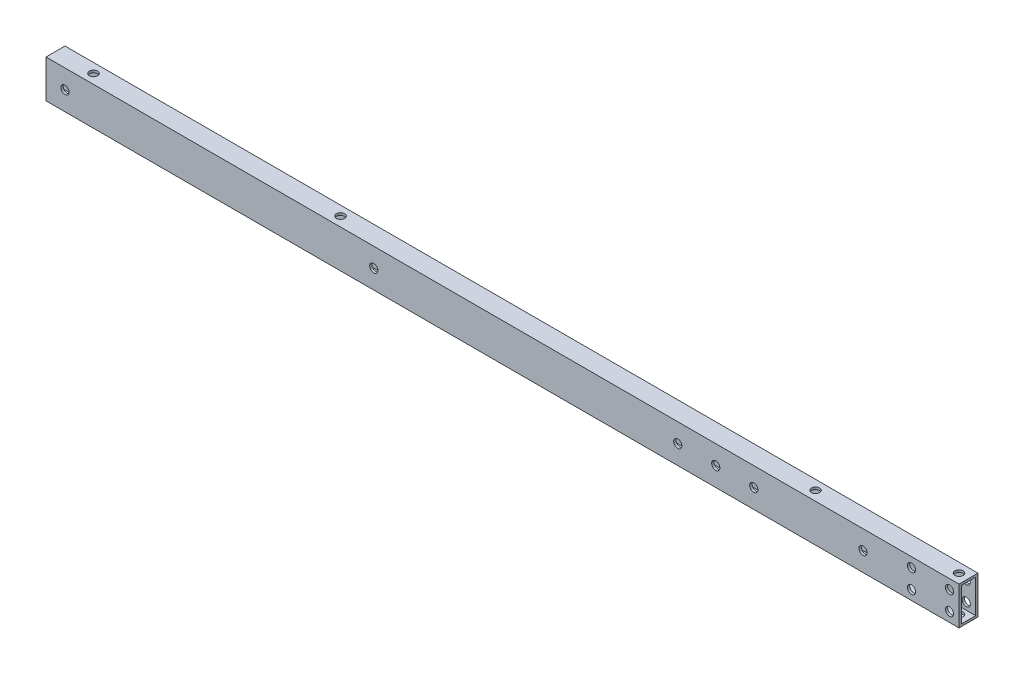
ISO-10303-21;
HEADER;
FILE_DESCRIPTION(('STEP AP214'),'2;1');
FILE_NAME('part.step','',(''),(''),'','','');
FILE_SCHEMA(('AUTOMOTIVE_DESIGN { 1 0 10303 214 1 1 1 1 }'));
ENDSEC;
DATA;
#1=APPLICATION_CONTEXT('core data for automotive mechanical design processes');
#2=APPLICATION_PROTOCOL_DEFINITION('international standard','automotive_design',2000,#1);
#3=PRODUCT_CONTEXT('',#1,'mechanical');
#4=PRODUCT('Part','Part','',(#3));
#5=PRODUCT_RELATED_PRODUCT_CATEGORY('part','',(#4));
#6=PRODUCT_DEFINITION_FORMATION('','',#4);
#7=PRODUCT_DEFINITION_CONTEXT('part definition',#1,'design');
#8=PRODUCT_DEFINITION('design','',#6,#7);
#9=PRODUCT_DEFINITION_SHAPE('','',#8);
#10=(LENGTH_UNIT() NAMED_UNIT(*) SI_UNIT(.MILLI.,.METRE.));
#11=(NAMED_UNIT(*) PLANE_ANGLE_UNIT() SI_UNIT($,.RADIAN.));
#12=(NAMED_UNIT(*) SI_UNIT($,.STERADIAN.) SOLID_ANGLE_UNIT());
#13=UNCERTAINTY_MEASURE_WITH_UNIT(LENGTH_MEASURE(1.E-05),#10,'distance_accuracy_value','');
#14=(GEOMETRIC_REPRESENTATION_CONTEXT(3) GLOBAL_UNCERTAINTY_ASSIGNED_CONTEXT((#13)) GLOBAL_UNIT_ASSIGNED_CONTEXT((#10,
#11,#12)) REPRESENTATION_CONTEXT('',''));
#15=CARTESIAN_POINT('',(0.,0.,0.));
#16=DIRECTION('',(0.,0.,1.));
#17=DIRECTION('',(1.,0.,0.));
#18=AXIS2_PLACEMENT_3D('',#15,#16,#17);
#19=CARTESIAN_POINT('',(480.5,0.,0.));
#20=DIRECTION('',(1.,0.,0.));
#21=DIRECTION('',(0.,0.,-1.));
#22=AXIS2_PLACEMENT_3D('',#19,#20,#21);
#23=PLANE('',#22);
#24=DIRECTION('',(0.,1.,0.));
#25=VECTOR('',#24,1.);
#26=CARTESIAN_POINT('',(480.5,10.,-5.));
#27=LINE('',#26,#25);
#28=CARTESIAN_POINT('',(480.5,-10.,-5.));
#29=VERTEX_POINT('',#28);
#30=CARTESIAN_POINT('',(480.5,10.,-5.));
#31=VERTEX_POINT('',#30);
#32=EDGE_CURVE('E164',#29,#31,#27,.T.);
#33=ORIENTED_EDGE('',*,*,#32,.T.);
#34=DIRECTION('',(0.,0.,1.));
#35=VECTOR('',#34,1.);
#36=CARTESIAN_POINT('',(480.5,10.,5.));
#37=LINE('',#36,#35);
#38=CARTESIAN_POINT('',(480.5,10.,5.));
#39=VERTEX_POINT('',#38);
#40=EDGE_CURVE('E167',#31,#39,#37,.T.);
#41=ORIENTED_EDGE('',*,*,#40,.T.);
#42=DIRECTION('',(0.,-1.,0.));
#43=VECTOR('',#42,1.);
#44=CARTESIAN_POINT('',(480.5,10.,5.));
#45=LINE('',#44,#43);
#46=CARTESIAN_POINT('',(480.5,-10.,5.));
#47=VERTEX_POINT('',#46);
#48=EDGE_CURVE('E170',#39,#47,#45,.T.);
#49=ORIENTED_EDGE('',*,*,#48,.T.);
#50=DIRECTION('',(0.,0.,-1.));
#51=VECTOR('',#50,1.);
#52=CARTESIAN_POINT('',(480.5,-10.,5.));
#53=LINE('',#52,#51);
#54=EDGE_CURVE('E172',#47,#29,#53,.T.);
#55=ORIENTED_EDGE('',*,*,#54,.T.);
#56=EDGE_LOOP('',(#33,#41,#49,#55));
#57=FACE_BOUND('',#56,.T.);
#58=DIRECTION('',(0.,0.,1.));
#59=VECTOR('',#58,1.);
#60=CARTESIAN_POINT('',(480.5,8.8,5.));
#61=LINE('',#60,#59);
#62=CARTESIAN_POINT('',(480.5,8.8,-3.8));
#63=VERTEX_POINT('',#62);
#64=CARTESIAN_POINT('',(480.5,8.8,3.8));
#65=VERTEX_POINT('',#64);
#66=EDGE_CURVE('E134',#63,#65,#61,.T.);
#67=ORIENTED_EDGE('',*,*,#66,.F.);
#68=DIRECTION('',(0.,1.,0.));
#69=VECTOR('',#68,1.);
#70=CARTESIAN_POINT('',(480.5,10.,-3.8));
#71=LINE('',#70,#69);
#72=CARTESIAN_POINT('',(480.5,-8.8,-3.8));
#73=VERTEX_POINT('',#72);
#74=EDGE_CURVE('E126',#73,#63,#71,.T.);
#75=ORIENTED_EDGE('',*,*,#74,.F.);
#76=DIRECTION('',(0.,0.,-1.));
#77=VECTOR('',#76,1.);
#78=CARTESIAN_POINT('',(480.5,-8.8,5.));
#79=LINE('',#78,#77);
#80=CARTESIAN_POINT('',(480.5,-8.8,3.8));
#81=VERTEX_POINT('',#80);
#82=EDGE_CURVE('E148',#81,#73,#79,.T.);
#83=ORIENTED_EDGE('',*,*,#82,.F.);
#84=DIRECTION('',(0.,-1.,0.));
#85=VECTOR('',#84,1.);
#86=CARTESIAN_POINT('',(480.5,10.,3.8));
#87=LINE('',#86,#85);
#88=EDGE_CURVE('E146',#65,#81,#87,.T.);
#89=ORIENTED_EDGE('',*,*,#88,.F.);
#90=EDGE_LOOP('',(#67,#75,#83,#89));
#91=FACE_BOUND('',#90,.T.);
#92=ADVANCED_FACE('F59',(#57,#91),#23,.T.);
#93=CARTESIAN_POINT('',(0.,0.,0.));
#94=DIRECTION('',(1.,0.,0.));
#95=DIRECTION('',(0.,0.,-1.));
#96=AXIS2_PLACEMENT_3D('',#93,#94,#95);
#97=PLANE('',#96);
#98=DIRECTION('',(0.,1.,0.));
#99=VECTOR('',#98,1.);
#100=CARTESIAN_POINT('',(0.,10.,-5.));
#101=LINE('',#100,#99);
#102=CARTESIAN_POINT('',(0.,-10.,-5.));
#103=VERTEX_POINT('',#102);
#104=CARTESIAN_POINT('',(0.,10.,-5.));
#105=VERTEX_POINT('',#104);
#106=EDGE_CURVE('E142',#103,#105,#101,.T.);
#107=ORIENTED_EDGE('',*,*,#106,.F.);
#108=DIRECTION('',(0.,0.,-1.));
#109=VECTOR('',#108,1.);
#110=CARTESIAN_POINT('',(0.,-10.,5.));
#111=LINE('',#110,#109);
#112=CARTESIAN_POINT('',(0.,-10.,5.));
#113=VERTEX_POINT('',#112);
#114=EDGE_CURVE('E168',#113,#103,#111,.T.);
#115=ORIENTED_EDGE('',*,*,#114,.F.);
#116=DIRECTION('',(0.,-1.,0.));
#117=VECTOR('',#116,1.);
#118=CARTESIAN_POINT('',(0.,10.,5.));
#119=LINE('',#118,#117);
#120=CARTESIAN_POINT('',(0.,10.,5.));
#121=VERTEX_POINT('',#120);
#122=EDGE_CURVE('E179',#121,#113,#119,.T.);
#123=ORIENTED_EDGE('',*,*,#122,.F.);
#124=DIRECTION('',(0.,0.,1.));
#125=VECTOR('',#124,1.);
#126=CARTESIAN_POINT('',(0.,10.,5.));
#127=LINE('',#126,#125);
#128=EDGE_CURVE('E177',#105,#121,#127,.T.);
#129=ORIENTED_EDGE('',*,*,#128,.F.);
#130=EDGE_LOOP('',(#107,#115,#123,#129));
#131=FACE_BOUND('',#130,.T.);
#132=DIRECTION('',(0.,1.,0.));
#133=VECTOR('',#132,1.);
#134=CARTESIAN_POINT('',(0.,10.,-3.8));
#135=LINE('',#134,#133);
#136=CARTESIAN_POINT('',(0.,-8.8,-3.8));
#137=VERTEX_POINT('',#136);
#138=CARTESIAN_POINT('',(0.,8.8,-3.8));
#139=VERTEX_POINT('',#138);
#140=EDGE_CURVE('E84',#137,#139,#135,.T.);
#141=ORIENTED_EDGE('',*,*,#140,.T.);
#142=DIRECTION('',(0.,0.,1.));
#143=VECTOR('',#142,1.);
#144=CARTESIAN_POINT('',(0.,8.8,5.));
#145=LINE('',#144,#143);
#146=CARTESIAN_POINT('',(0.,8.8,3.8));
#147=VERTEX_POINT('',#146);
#148=EDGE_CURVE('E141',#139,#147,#145,.T.);
#149=ORIENTED_EDGE('',*,*,#148,.T.);
#150=DIRECTION('',(0.,-1.,0.));
#151=VECTOR('',#150,1.);
#152=CARTESIAN_POINT('',(0.,10.,3.8));
#153=LINE('',#152,#151);
#154=CARTESIAN_POINT('',(0.,-8.8,3.8));
#155=VERTEX_POINT('',#154);
#156=EDGE_CURVE('E156',#147,#155,#153,.T.);
#157=ORIENTED_EDGE('',*,*,#156,.T.);
#158=DIRECTION('',(0.,0.,-1.));
#159=VECTOR('',#158,1.);
#160=CARTESIAN_POINT('',(0.,-8.8,5.));
#161=LINE('',#160,#159);
#162=EDGE_CURVE('E135',#155,#137,#161,.T.);
#163=ORIENTED_EDGE('',*,*,#162,.T.);
#164=EDGE_LOOP('',(#141,#149,#157,#163));
#165=FACE_BOUND('',#164,.T.);
#166=ADVANCED_FACE('F370',(#131,#165),#97,.F.);
#167=CARTESIAN_POINT('',(480.5,10.,-5.));
#168=DIRECTION('',(0.,0.,1.));
#169=DIRECTION('',(0.,-1.,0.));
#170=AXIS2_PLACEMENT_3D('',#167,#168,#169);
#171=PLANE('',#170);
#172=CARTESIAN_POINT('',(475.5,5.,-5.));
#173=DIRECTION('',(0.,0.,1.));
#174=DIRECTION('',(1.,0.,0.));
#175=AXIS2_PLACEMENT_3D('',#172,#173,#174);
#176=CIRCLE('',#175,2.14999999999996);
#177=CARTESIAN_POINT('',(477.65,5.,-5.));
#178=VERTEX_POINT('',#177);
#179=EDGE_CURVE('E273',#178,#178,#176,.T.);
#180=ORIENTED_EDGE('',*,*,#179,.T.);
#181=EDGE_LOOP('',(#180));
#182=FACE_BOUND('',#181,.T.);
#183=CARTESIAN_POINT('',(172.5,0.,-5.));
#184=DIRECTION('',(0.,0.,1.));
#185=DIRECTION('',(1.,0.,0.));
#186=AXIS2_PLACEMENT_3D('',#183,#184,#185);
#187=CIRCLE('',#186,2.15000000000002);
#188=CARTESIAN_POINT('',(174.65,0.,-5.));
#189=VERTEX_POINT('',#188);
#190=EDGE_CURVE('E280',#189,#189,#187,.T.);
#191=ORIENTED_EDGE('',*,*,#190,.T.);
#192=EDGE_LOOP('',(#191));
#193=FACE_BOUND('',#192,.T.);
#194=CARTESIAN_POINT('',(475.5,-4.99999999999997,-5.));
#195=DIRECTION('',(0.,0.,1.));
#196=DIRECTION('',(-1.,0.,0.));
#197=AXIS2_PLACEMENT_3D('',#194,#195,#196);
#198=CIRCLE('',#197,2.14999999999996);
#199=CARTESIAN_POINT('',(473.35,-4.99999999999997,-5.));
#200=VERTEX_POINT('',#199);
#201=EDGE_CURVE('E261',#200,#200,#198,.T.);
#202=ORIENTED_EDGE('',*,*,#201,.T.);
#203=EDGE_LOOP('',(#202));
#204=FACE_BOUND('',#203,.T.);
#205=CARTESIAN_POINT('',(455.5,5.,-5.));
#206=DIRECTION('',(0.,0.,1.));
#207=DIRECTION('',(1.,0.,0.));
#208=AXIS2_PLACEMENT_3D('',#205,#206,#207);
#209=CIRCLE('',#208,2.14999999999996);
#210=CARTESIAN_POINT('',(457.65,5.,-5.));
#211=VERTEX_POINT('',#210);
#212=EDGE_CURVE('E268',#211,#211,#209,.T.);
#213=ORIENTED_EDGE('',*,*,#212,.T.);
#214=EDGE_LOOP('',(#213));
#215=FACE_BOUND('',#214,.T.);
#216=CARTESIAN_POINT('',(332.5,0.,-5.));
#217=DIRECTION('',(0.,0.,1.));
#218=DIRECTION('',(-1.,0.,0.));
#219=AXIS2_PLACEMENT_3D('',#216,#217,#218);
#220=CIRCLE('',#219,2.15000000000002);
#221=CARTESIAN_POINT('',(330.35,0.,-5.));
#222=VERTEX_POINT('',#221);
#223=EDGE_CURVE('E297',#222,#222,#220,.T.);
#224=ORIENTED_EDGE('',*,*,#223,.T.);
#225=EDGE_LOOP('',(#224));
#226=FACE_BOUND('',#225,.T.);
#227=CARTESIAN_POINT('',(352.5,0.,-5.));
#228=DIRECTION('',(0.,0.,1.));
#229=DIRECTION('',(1.,0.,0.));
#230=AXIS2_PLACEMENT_3D('',#227,#228,#229);
#231=CIRCLE('',#230,2.15000000000002);
#232=CARTESIAN_POINT('',(354.65,0.,-5.));
#233=VERTEX_POINT('',#232);
#234=EDGE_CURVE('E304',#233,#233,#231,.T.);
#235=ORIENTED_EDGE('',*,*,#234,.T.);
#236=EDGE_LOOP('',(#235));
#237=FACE_BOUND('',#236,.T.);
#238=CARTESIAN_POINT('',(430.,0.,-5.));
#239=DIRECTION('',(0.,0.,1.));
#240=DIRECTION('',(1.,0.,0.));
#241=AXIS2_PLACEMENT_3D('',#238,#239,#240);
#242=CIRCLE('',#241,2.14999999999996);
#243=CARTESIAN_POINT('',(432.15,0.,-5.));
#244=VERTEX_POINT('',#243);
#245=EDGE_CURVE('E285',#244,#244,#242,.T.);
#246=ORIENTED_EDGE('',*,*,#245,.T.);
#247=EDGE_LOOP('',(#246));
#248=FACE_BOUND('',#247,.T.);
#249=CARTESIAN_POINT('',(10.,0.,-5.));
#250=DIRECTION('',(0.,0.,1.));
#251=DIRECTION('',(1.,0.,0.));
#252=AXIS2_PLACEMENT_3D('',#249,#250,#251);
#253=CIRCLE('',#252,2.15);
#254=CARTESIAN_POINT('',(12.15,0.,-5.));
#255=VERTEX_POINT('',#254);
#256=EDGE_CURVE('E292',#255,#255,#253,.T.);
#257=ORIENTED_EDGE('',*,*,#256,.T.);
#258=EDGE_LOOP('',(#257));
#259=FACE_BOUND('',#258,.T.);
#260=CARTESIAN_POINT('',(455.5,-4.99999999999998,-5.));
#261=DIRECTION('',(0.,0.,1.));
#262=DIRECTION('',(1.,0.,0.));
#263=AXIS2_PLACEMENT_3D('',#260,#261,#262);
#264=CIRCLE('',#263,2.14999999999996);
#265=CARTESIAN_POINT('',(457.65,-4.99999999999998,-5.));
#266=VERTEX_POINT('',#265);
#267=EDGE_CURVE('E255',#266,#266,#264,.T.);
#268=ORIENTED_EDGE('',*,*,#267,.T.);
#269=EDGE_LOOP('',(#268));
#270=FACE_BOUND('',#269,.T.);
#271=CARTESIAN_POINT('',(372.5,0.,-5.));
#272=DIRECTION('',(0.,0.,1.));
#273=DIRECTION('',(1.,0.,0.));
#274=AXIS2_PLACEMENT_3D('',#271,#272,#273);
#275=CIRCLE('',#274,2.15000000000002);
#276=CARTESIAN_POINT('',(374.65,0.,-5.));
#277=VERTEX_POINT('',#276);
#278=EDGE_CURVE('E193',#277,#277,#275,.T.);
#279=ORIENTED_EDGE('',*,*,#278,.T.);
#280=EDGE_LOOP('',(#279));
#281=FACE_BOUND('',#280,.T.);
#282=ORIENTED_EDGE('',*,*,#106,.T.);
#283=DIRECTION('',(-1.,0.,0.));
#284=VECTOR('',#283,1.);
#285=CARTESIAN_POINT('',(480.5,10.,-5.));
#286=LINE('',#285,#284);
#287=EDGE_CURVE('E12',#31,#105,#286,.T.);
#288=ORIENTED_EDGE('',*,*,#287,.F.);
#289=ORIENTED_EDGE('',*,*,#32,.F.);
#290=DIRECTION('',(-1.,0.,0.));
#291=VECTOR('',#290,1.);
#292=CARTESIAN_POINT('',(480.5,-10.,-5.));
#293=LINE('',#292,#291);
#294=EDGE_CURVE('E174',#29,#103,#293,.T.);
#295=ORIENTED_EDGE('',*,*,#294,.T.);
#296=EDGE_LOOP('',(#282,#288,#289,#295));
#297=FACE_BOUND('',#296,.T.);
#298=ADVANCED_FACE('F61',(#182,#193,#204,#215,#226,#237,#248,#259,#270,#281,#297),#171,.F.);
#299=CARTESIAN_POINT('',(480.5,10.,5.));
#300=DIRECTION('',(0.,-1.,0.));
#301=DIRECTION('',(0.,0.,-1.));
#302=AXIS2_PLACEMENT_3D('',#299,#300,#301);
#303=PLANE('',#302);
#304=CARTESIAN_POINT('',(475.5,10.,0.));
#305=DIRECTION('',(0.,1.,0.));
#306=DIRECTION('',(0.,0.,1.));
#307=AXIS2_PLACEMENT_3D('',#304,#305,#306);
#308=CIRCLE('',#307,2.14999999999996);
#309=CARTESIAN_POINT('',(475.5,10.,2.14999999999996));
#310=VERTEX_POINT('',#309);
#311=EDGE_CURVE('E497',#310,#310,#308,.T.);
#312=ORIENTED_EDGE('',*,*,#311,.F.);
#313=EDGE_LOOP('',(#312));
#314=FACE_BOUND('',#313,.T.);
#315=CARTESIAN_POINT('',(400.,10.,0.));
#316=DIRECTION('',(0.,1.,0.));
#317=DIRECTION('',(0.,0.,1.));
#318=AXIS2_PLACEMENT_3D('',#315,#316,#317);
#319=CIRCLE('',#318,2.14999999999996);
#320=CARTESIAN_POINT('',(400.,10.,2.14999999999997));
#321=VERTEX_POINT('',#320);
#322=EDGE_CURVE('E503',#321,#321,#319,.T.);
#323=ORIENTED_EDGE('',*,*,#322,.F.);
#324=EDGE_LOOP('',(#323));
#325=FACE_BOUND('',#324,.T.);
#326=CARTESIAN_POINT('',(150.,10.,0.));
#327=DIRECTION('',(0.,1.,0.));
#328=DIRECTION('',(0.,0.,1.));
#329=AXIS2_PLACEMENT_3D('',#326,#327,#328);
#330=CIRCLE('',#329,2.15000000000002);
#331=CARTESIAN_POINT('',(150.,10.,2.15000000000002));
#332=VERTEX_POINT('',#331);
#333=EDGE_CURVE('E511',#332,#332,#330,.T.);
#334=ORIENTED_EDGE('',*,*,#333,.F.);
#335=EDGE_LOOP('',(#334));
#336=FACE_BOUND('',#335,.T.);
#337=CARTESIAN_POINT('',(20.,10.,0.));
#338=DIRECTION('',(0.,1.,0.));
#339=DIRECTION('',(0.,0.,1.));
#340=AXIS2_PLACEMENT_3D('',#337,#338,#339);
#341=CIRCLE('',#340,2.15);
#342=CARTESIAN_POINT('',(20.,10.,2.15));
#343=VERTEX_POINT('',#342);
#344=EDGE_CURVE('E516',#343,#343,#341,.T.);
#345=ORIENTED_EDGE('',*,*,#344,.F.);
#346=EDGE_LOOP('',(#345));
#347=FACE_BOUND('',#346,.T.);
#348=ORIENTED_EDGE('',*,*,#128,.T.);
#349=DIRECTION('',(-1.,0.,0.));
#350=VECTOR('',#349,1.);
#351=CARTESIAN_POINT('',(480.5,10.,5.));
#352=LINE('',#351,#350);
#353=EDGE_CURVE('E68',#39,#121,#352,.T.);
#354=ORIENTED_EDGE('',*,*,#353,.F.);
#355=ORIENTED_EDGE('',*,*,#40,.F.);
#356=ORIENTED_EDGE('',*,*,#287,.T.);
#357=EDGE_LOOP('',(#348,#354,#355,#356));
#358=FACE_BOUND('',#357,.T.);
#359=ADVANCED_FACE('F369',(#314,#325,#336,#347,#358),#303,.F.);
#360=CARTESIAN_POINT('',(480.5,10.,5.));
#361=DIRECTION('',(0.,0.,-1.));
#362=DIRECTION('',(0.,1.,0.));
#363=AXIS2_PLACEMENT_3D('',#360,#361,#362);
#364=PLANE('',#363);
#365=CARTESIAN_POINT('',(475.5,5.,5.));
#366=DIRECTION('',(0.,0.,1.));
#367=DIRECTION('',(1.,0.,0.));
#368=AXIS2_PLACEMENT_3D('',#365,#366,#367);
#369=CIRCLE('',#368,2.14999999999996);
#370=CARTESIAN_POINT('',(477.65,5.,5.));
#371=VERTEX_POINT('',#370);
#372=EDGE_CURVE('E277',#371,#371,#369,.T.);
#373=ORIENTED_EDGE('',*,*,#372,.F.);
#374=EDGE_LOOP('',(#373));
#375=FACE_BOUND('',#374,.T.);
#376=CARTESIAN_POINT('',(172.5,0.,5.));
#377=DIRECTION('',(0.,0.,1.));
#378=DIRECTION('',(1.,0.,0.));
#379=AXIS2_PLACEMENT_3D('',#376,#377,#378);
#380=CIRCLE('',#379,2.15000000000002);
#381=CARTESIAN_POINT('',(174.65,0.,5.));
#382=VERTEX_POINT('',#381);
#383=EDGE_CURVE('E264',#382,#382,#380,.T.);
#384=ORIENTED_EDGE('',*,*,#383,.F.);
#385=EDGE_LOOP('',(#384));
#386=FACE_BOUND('',#385,.T.);
#387=CARTESIAN_POINT('',(475.5,-4.99999999999997,5.));
#388=DIRECTION('',(0.,0.,1.));
#389=DIRECTION('',(-1.,0.,0.));
#390=AXIS2_PLACEMENT_3D('',#387,#388,#389);
#391=CIRCLE('',#390,2.14999999999996);
#392=CARTESIAN_POINT('',(473.35,-4.99999999999997,5.));
#393=VERTEX_POINT('',#392);
#394=EDGE_CURVE('E265',#393,#393,#391,.T.);
#395=ORIENTED_EDGE('',*,*,#394,.F.);
#396=EDGE_LOOP('',(#395));
#397=FACE_BOUND('',#396,.T.);
#398=CARTESIAN_POINT('',(455.5,5.,5.));
#399=DIRECTION('',(0.,0.,1.));
#400=DIRECTION('',(1.,0.,0.));
#401=AXIS2_PLACEMENT_3D('',#398,#399,#400);
#402=CIRCLE('',#401,2.14999999999996);
#403=CARTESIAN_POINT('',(457.65,5.,5.));
#404=VERTEX_POINT('',#403);
#405=EDGE_CURVE('E258',#404,#404,#402,.T.);
#406=ORIENTED_EDGE('',*,*,#405,.F.);
#407=EDGE_LOOP('',(#406));
#408=FACE_BOUND('',#407,.T.);
#409=CARTESIAN_POINT('',(332.5,0.,5.));
#410=DIRECTION('',(0.,0.,1.));
#411=DIRECTION('',(-1.,0.,0.));
#412=AXIS2_PLACEMENT_3D('',#409,#410,#411);
#413=CIRCLE('',#412,2.15000000000002);
#414=CARTESIAN_POINT('',(330.35,0.,5.));
#415=VERTEX_POINT('',#414);
#416=EDGE_CURVE('E301',#415,#415,#413,.T.);
#417=ORIENTED_EDGE('',*,*,#416,.F.);
#418=EDGE_LOOP('',(#417));
#419=FACE_BOUND('',#418,.T.);
#420=CARTESIAN_POINT('',(352.5,0.,5.));
#421=DIRECTION('',(0.,0.,1.));
#422=DIRECTION('',(1.,0.,0.));
#423=AXIS2_PLACEMENT_3D('',#420,#421,#422);
#424=CIRCLE('',#423,2.15000000000002);
#425=CARTESIAN_POINT('',(354.65,0.,5.));
#426=VERTEX_POINT('',#425);
#427=EDGE_CURVE('E288',#426,#426,#424,.T.);
#428=ORIENTED_EDGE('',*,*,#427,.F.);
#429=EDGE_LOOP('',(#428));
#430=FACE_BOUND('',#429,.T.);
#431=CARTESIAN_POINT('',(430.,0.,5.));
#432=DIRECTION('',(0.,0.,1.));
#433=DIRECTION('',(1.,0.,0.));
#434=AXIS2_PLACEMENT_3D('',#431,#432,#433);
#435=CIRCLE('',#434,2.14999999999996);
#436=CARTESIAN_POINT('',(432.15,0.,5.));
#437=VERTEX_POINT('',#436);
#438=EDGE_CURVE('E289',#437,#437,#435,.T.);
#439=ORIENTED_EDGE('',*,*,#438,.F.);
#440=EDGE_LOOP('',(#439));
#441=FACE_BOUND('',#440,.T.);
#442=CARTESIAN_POINT('',(10.,0.,5.));
#443=DIRECTION('',(0.,0.,1.));
#444=DIRECTION('',(1.,0.,0.));
#445=AXIS2_PLACEMENT_3D('',#442,#443,#444);
#446=CIRCLE('',#445,2.15);
#447=CARTESIAN_POINT('',(12.15,0.,5.));
#448=VERTEX_POINT('',#447);
#449=EDGE_CURVE('E276',#448,#448,#446,.T.);
#450=ORIENTED_EDGE('',*,*,#449,.F.);
#451=EDGE_LOOP('',(#450));
#452=FACE_BOUND('',#451,.T.);
#453=CARTESIAN_POINT('',(455.5,-4.99999999999998,5.));
#454=DIRECTION('',(0.,0.,1.));
#455=DIRECTION('',(1.,0.,0.));
#456=AXIS2_PLACEMENT_3D('',#453,#454,#455);
#457=CIRCLE('',#456,2.14999999999996);
#458=CARTESIAN_POINT('',(457.65,-4.99999999999998,5.));
#459=VERTEX_POINT('',#458);
#460=EDGE_CURVE('E254',#459,#459,#457,.T.);
#461=ORIENTED_EDGE('',*,*,#460,.F.);
#462=EDGE_LOOP('',(#461));
#463=FACE_BOUND('',#462,.T.);
#464=CARTESIAN_POINT('',(372.5,0.,5.));
#465=DIRECTION('',(0.,0.,1.));
#466=DIRECTION('',(1.,0.,0.));
#467=AXIS2_PLACEMENT_3D('',#464,#465,#466);
#468=CIRCLE('',#467,2.15000000000002);
#469=CARTESIAN_POINT('',(374.65,0.,5.));
#470=VERTEX_POINT('',#469);
#471=EDGE_CURVE('E300',#470,#470,#468,.T.);
#472=ORIENTED_EDGE('',*,*,#471,.F.);
#473=EDGE_LOOP('',(#472));
#474=FACE_BOUND('',#473,.T.);
#475=ORIENTED_EDGE('',*,*,#122,.T.);
#476=DIRECTION('',(-1.,0.,0.));
#477=VECTOR('',#476,1.);
#478=CARTESIAN_POINT('',(480.5,-10.,5.));
#479=LINE('',#478,#477);
#480=EDGE_CURVE('E184',#47,#113,#479,.T.);
#481=ORIENTED_EDGE('',*,*,#480,.F.);
#482=ORIENTED_EDGE('',*,*,#48,.F.);
#483=ORIENTED_EDGE('',*,*,#353,.T.);
#484=EDGE_LOOP('',(#475,#481,#482,#483));
#485=FACE_BOUND('',#484,.T.);
#486=ADVANCED_FACE('F388',(#375,#386,#397,#408,#419,#430,#441,#452,#463,#474,#485),#364,.F.);
#487=CARTESIAN_POINT('',(480.5,-10.,5.));
#488=DIRECTION('',(0.,1.,0.));
#489=DIRECTION('',(0.,0.,1.));
#490=AXIS2_PLACEMENT_3D('',#487,#488,#489);
#491=PLANE('',#490);
#492=CARTESIAN_POINT('',(475.5,-10.,0.));
#493=DIRECTION('',(0.,1.,0.));
#494=DIRECTION('',(0.,0.,1.));
#495=AXIS2_PLACEMENT_3D('',#492,#493,#494);
#496=CIRCLE('',#495,2.14999999999996);
#497=CARTESIAN_POINT('',(475.5,-10.,2.14999999999996));
#498=VERTEX_POINT('',#497);
#499=EDGE_CURVE('E233',#498,#498,#496,.T.);
#500=ORIENTED_EDGE('',*,*,#499,.T.);
#501=EDGE_LOOP('',(#500));
#502=FACE_BOUND('',#501,.T.);
#503=CARTESIAN_POINT('',(400.,-10.,0.));
#504=DIRECTION('',(0.,1.,0.));
#505=DIRECTION('',(0.,0.,1.));
#506=AXIS2_PLACEMENT_3D('',#503,#504,#505);
#507=CIRCLE('',#506,2.14999999999996);
#508=CARTESIAN_POINT('',(400.,-10.,2.14999999999997));
#509=VERTEX_POINT('',#508);
#510=EDGE_CURVE('E498',#509,#509,#507,.T.);
#511=ORIENTED_EDGE('',*,*,#510,.T.);
#512=EDGE_LOOP('',(#511));
#513=FACE_BOUND('',#512,.T.);
#514=CARTESIAN_POINT('',(150.,-10.,0.));
#515=DIRECTION('',(0.,1.,0.));
#516=DIRECTION('',(0.,0.,1.));
#517=AXIS2_PLACEMENT_3D('',#514,#515,#516);
#518=CIRCLE('',#517,2.15000000000002);
#519=CARTESIAN_POINT('',(150.,-10.,2.15000000000002));
#520=VERTEX_POINT('',#519);
#521=EDGE_CURVE('E508',#520,#520,#518,.T.);
#522=ORIENTED_EDGE('',*,*,#521,.T.);
#523=EDGE_LOOP('',(#522));
#524=FACE_BOUND('',#523,.T.);
#525=CARTESIAN_POINT('',(20.,-10.,0.));
#526=DIRECTION('',(0.,1.,0.));
#527=DIRECTION('',(0.,0.,1.));
#528=AXIS2_PLACEMENT_3D('',#525,#526,#527);
#529=CIRCLE('',#528,2.15);
#530=CARTESIAN_POINT('',(20.,-10.,2.15));
#531=VERTEX_POINT('',#530);
#532=EDGE_CURVE('E514',#531,#531,#529,.T.);
#533=ORIENTED_EDGE('',*,*,#532,.T.);
#534=EDGE_LOOP('',(#533));
#535=FACE_BOUND('',#534,.T.);
#536=ORIENTED_EDGE('',*,*,#114,.T.);
#537=ORIENTED_EDGE('',*,*,#294,.F.);
#538=ORIENTED_EDGE('',*,*,#54,.F.);
#539=ORIENTED_EDGE('',*,*,#480,.T.);
#540=EDGE_LOOP('',(#536,#537,#538,#539));
#541=FACE_BOUND('',#540,.T.);
#542=ADVANCED_FACE('F338',(#502,#513,#524,#535,#541),#491,.F.);
#543=CARTESIAN_POINT('',(480.5,10.,-3.8));
#544=DIRECTION('',(0.,0.,1.));
#545=DIRECTION('',(0.,-1.,0.));
#546=AXIS2_PLACEMENT_3D('',#543,#544,#545);
#547=PLANE('',#546);
#548=CARTESIAN_POINT('',(475.5,5.,-3.8));
#549=DIRECTION('',(0.,0.,1.));
#550=DIRECTION('',(0.,-1.,0.));
#551=AXIS2_PLACEMENT_3D('',#548,#549,#550);
#552=CIRCLE('',#551,2.14999999999996);
#553=CARTESIAN_POINT('',(475.5,2.85000000000004,-3.8));
#554=VERTEX_POINT('',#553);
#555=EDGE_CURVE('E154',#554,#554,#552,.T.);
#556=ORIENTED_EDGE('',*,*,#555,.F.);
#557=EDGE_LOOP('',(#556));
#558=FACE_BOUND('',#557,.T.);
#559=CARTESIAN_POINT('',(172.5,0.,-3.8));
#560=DIRECTION('',(0.,0.,1.));
#561=DIRECTION('',(0.,-1.,0.));
#562=AXIS2_PLACEMENT_3D('',#559,#560,#561);
#563=CIRCLE('',#562,2.15000000000002);
#564=CARTESIAN_POINT('',(172.5,-2.15000000000004,-3.8));
#565=VERTEX_POINT('',#564);
#566=EDGE_CURVE('E225',#565,#565,#563,.T.);
#567=ORIENTED_EDGE('',*,*,#566,.F.);
#568=EDGE_LOOP('',(#567));
#569=FACE_BOUND('',#568,.T.);
#570=CARTESIAN_POINT('',(475.5,-4.99999999999997,-3.8));
#571=DIRECTION('',(0.,0.,1.));
#572=DIRECTION('',(0.,-1.,0.));
#573=AXIS2_PLACEMENT_3D('',#570,#571,#572);
#574=CIRCLE('',#573,2.14999999999996);
#575=CARTESIAN_POINT('',(475.5,-7.14999999999993,-3.8));
#576=VERTEX_POINT('',#575);
#577=EDGE_CURVE('E221',#576,#576,#574,.T.);
#578=ORIENTED_EDGE('',*,*,#577,.F.);
#579=EDGE_LOOP('',(#578));
#580=FACE_BOUND('',#579,.T.);
#581=CARTESIAN_POINT('',(455.5,5.,-3.8));
#582=DIRECTION('',(0.,0.,1.));
#583=DIRECTION('',(0.,-1.,0.));
#584=AXIS2_PLACEMENT_3D('',#581,#582,#583);
#585=CIRCLE('',#584,2.14999999999996);
#586=CARTESIAN_POINT('',(455.5,2.85000000000004,-3.8));
#587=VERTEX_POINT('',#586);
#588=EDGE_CURVE('E217',#587,#587,#585,.T.);
#589=ORIENTED_EDGE('',*,*,#588,.F.);
#590=EDGE_LOOP('',(#589));
#591=FACE_BOUND('',#590,.T.);
#592=CARTESIAN_POINT('',(332.5,0.,-3.8));
#593=DIRECTION('',(0.,0.,1.));
#594=DIRECTION('',(0.,-1.,0.));
#595=AXIS2_PLACEMENT_3D('',#592,#593,#594);
#596=CIRCLE('',#595,2.15000000000002);
#597=CARTESIAN_POINT('',(332.5,-2.15000000000002,-3.8));
#598=VERTEX_POINT('',#597);
#599=EDGE_CURVE('E213',#598,#598,#596,.T.);
#600=ORIENTED_EDGE('',*,*,#599,.F.);
#601=EDGE_LOOP('',(#600));
#602=FACE_BOUND('',#601,.T.);
#603=CARTESIAN_POINT('',(352.5,0.,-3.8));
#604=DIRECTION('',(0.,0.,1.));
#605=DIRECTION('',(0.,-1.,0.));
#606=AXIS2_PLACEMENT_3D('',#603,#604,#605);
#607=CIRCLE('',#606,2.15000000000002);
#608=CARTESIAN_POINT('',(352.5,-2.15000000000002,-3.8));
#609=VERTEX_POINT('',#608);
#610=EDGE_CURVE('E209',#609,#609,#607,.T.);
#611=ORIENTED_EDGE('',*,*,#610,.F.);
#612=EDGE_LOOP('',(#611));
#613=FACE_BOUND('',#612,.T.);
#614=CARTESIAN_POINT('',(430.,0.,-3.8));
#615=DIRECTION('',(0.,0.,1.));
#616=DIRECTION('',(0.,-1.,0.));
#617=AXIS2_PLACEMENT_3D('',#614,#615,#616);
#618=CIRCLE('',#617,2.14999999999996);
#619=CARTESIAN_POINT('',(430.,-2.14999999999997,-3.8));
#620=VERTEX_POINT('',#619);
#621=EDGE_CURVE('E205',#620,#620,#618,.T.);
#622=ORIENTED_EDGE('',*,*,#621,.F.);
#623=EDGE_LOOP('',(#622));
#624=FACE_BOUND('',#623,.T.);
#625=CARTESIAN_POINT('',(10.,0.,-3.8));
#626=DIRECTION('',(0.,0.,1.));
#627=DIRECTION('',(0.,-1.,0.));
#628=AXIS2_PLACEMENT_3D('',#625,#626,#627);
#629=CIRCLE('',#628,2.15);
#630=CARTESIAN_POINT('',(10.,-2.15,-3.8));
#631=VERTEX_POINT('',#630);
#632=EDGE_CURVE('E201',#631,#631,#629,.T.);
#633=ORIENTED_EDGE('',*,*,#632,.F.);
#634=EDGE_LOOP('',(#633));
#635=FACE_BOUND('',#634,.T.);
#636=CARTESIAN_POINT('',(455.5,-4.99999999999998,-3.8));
#637=DIRECTION('',(0.,0.,1.));
#638=DIRECTION('',(0.,-1.,0.));
#639=AXIS2_PLACEMENT_3D('',#636,#637,#638);
#640=CIRCLE('',#639,2.14999999999996);
#641=CARTESIAN_POINT('',(455.5,-7.14999999999994,-3.8));
#642=VERTEX_POINT('',#641);
#643=EDGE_CURVE('E197',#642,#642,#640,.T.);
#644=ORIENTED_EDGE('',*,*,#643,.F.);
#645=EDGE_LOOP('',(#644));
#646=FACE_BOUND('',#645,.T.);
#647=CARTESIAN_POINT('',(372.5,0.,-3.8));
#648=DIRECTION('',(0.,0.,1.));
#649=DIRECTION('',(0.,-1.,0.));
#650=AXIS2_PLACEMENT_3D('',#647,#648,#649);
#651=CIRCLE('',#650,2.15000000000002);
#652=CARTESIAN_POINT('',(372.5,-2.15000000000002,-3.8));
#653=VERTEX_POINT('',#652);
#654=EDGE_CURVE('E192',#653,#653,#651,.T.);
#655=ORIENTED_EDGE('',*,*,#654,.F.);
#656=EDGE_LOOP('',(#655));
#657=FACE_BOUND('',#656,.T.);
#658=ORIENTED_EDGE('',*,*,#140,.F.);
#659=DIRECTION('',(-1.,0.,0.));
#660=VECTOR('',#659,1.);
#661=CARTESIAN_POINT('',(480.5,-8.8,-3.8));
#662=LINE('',#661,#660);
#663=EDGE_CURVE('E130',#73,#137,#662,.T.);
#664=ORIENTED_EDGE('',*,*,#663,.F.);
#665=ORIENTED_EDGE('',*,*,#74,.T.);
#666=DIRECTION('',(-1.,0.,0.));
#667=VECTOR('',#666,1.);
#668=CARTESIAN_POINT('',(480.5,8.8,-3.8));
#669=LINE('',#668,#667);
#670=EDGE_CURVE('E129',#63,#139,#669,.T.);
#671=ORIENTED_EDGE('',*,*,#670,.T.);
#672=EDGE_LOOP('',(#658,#664,#665,#671));
#673=FACE_BOUND('',#672,.T.);
#674=ADVANCED_FACE('F128',(#558,#569,#580,#591,#602,#613,#624,#635,#646,#657,#673),#547,.T.);
#675=CARTESIAN_POINT('',(480.5,8.8,5.));
#676=DIRECTION('',(0.,-1.,0.));
#677=DIRECTION('',(0.,0.,-1.));
#678=AXIS2_PLACEMENT_3D('',#675,#676,#677);
#679=PLANE('',#678);
#680=CARTESIAN_POINT('',(475.5,8.8,0.));
#681=DIRECTION('',(0.,-1.,0.));
#682=DIRECTION('',(0.,0.,-1.));
#683=AXIS2_PLACEMENT_3D('',#680,#681,#682);
#684=CIRCLE('',#683,2.14999999999996);
#685=CARTESIAN_POINT('',(475.5,8.8,-2.14999999999996));
#686=VERTEX_POINT('',#685);
#687=EDGE_CURVE('E251',#686,#686,#684,.T.);
#688=ORIENTED_EDGE('',*,*,#687,.F.);
#689=EDGE_LOOP('',(#688));
#690=FACE_BOUND('',#689,.T.);
#691=CARTESIAN_POINT('',(400.,8.8,0.));
#692=DIRECTION('',(0.,-1.,0.));
#693=DIRECTION('',(0.,0.,-1.));
#694=AXIS2_PLACEMENT_3D('',#691,#692,#693);
#695=CIRCLE('',#694,2.14999999999996);
#696=CARTESIAN_POINT('',(400.,8.8,-2.14999999999995));
#697=VERTEX_POINT('',#696);
#698=EDGE_CURVE('E239',#697,#697,#695,.T.);
#699=ORIENTED_EDGE('',*,*,#698,.F.);
#700=EDGE_LOOP('',(#699));
#701=FACE_BOUND('',#700,.T.);
#702=CARTESIAN_POINT('',(150.,8.8,0.));
#703=DIRECTION('',(0.,-1.,0.));
#704=DIRECTION('',(0.,0.,-1.));
#705=AXIS2_PLACEMENT_3D('',#702,#703,#704);
#706=CIRCLE('',#705,2.15000000000002);
#707=CARTESIAN_POINT('',(150.,8.8,-2.15000000000002));
#708=VERTEX_POINT('',#707);
#709=EDGE_CURVE('E236',#708,#708,#706,.T.);
#710=ORIENTED_EDGE('',*,*,#709,.F.);
#711=EDGE_LOOP('',(#710));
#712=FACE_BOUND('',#711,.T.);
#713=CARTESIAN_POINT('',(20.,8.8,0.));
#714=DIRECTION('',(0.,-1.,0.));
#715=DIRECTION('',(0.,0.,-1.));
#716=AXIS2_PLACEMENT_3D('',#713,#714,#715);
#717=CIRCLE('',#716,2.15);
#718=CARTESIAN_POINT('',(20.,8.8,-2.15));
#719=VERTEX_POINT('',#718);
#720=EDGE_CURVE('E232',#719,#719,#717,.T.);
#721=ORIENTED_EDGE('',*,*,#720,.F.);
#722=EDGE_LOOP('',(#721));
#723=FACE_BOUND('',#722,.T.);
#724=ORIENTED_EDGE('',*,*,#148,.F.);
#725=ORIENTED_EDGE('',*,*,#670,.F.);
#726=ORIENTED_EDGE('',*,*,#66,.T.);
#727=DIRECTION('',(-1.,0.,0.));
#728=VECTOR('',#727,1.);
#729=CARTESIAN_POINT('',(480.5,8.8,3.8));
#730=LINE('',#729,#728);
#731=EDGE_CURVE('E143',#65,#147,#730,.T.);
#732=ORIENTED_EDGE('',*,*,#731,.T.);
#733=EDGE_LOOP('',(#724,#725,#726,#732));
#734=FACE_BOUND('',#733,.T.);
#735=ADVANCED_FACE('F138',(#690,#701,#712,#723,#734),#679,.T.);
#736=CARTESIAN_POINT('',(480.5,10.,3.8));
#737=DIRECTION('',(0.,0.,-1.));
#738=DIRECTION('',(0.,1.,0.));
#739=AXIS2_PLACEMENT_3D('',#736,#737,#738);
#740=PLANE('',#739);
#741=CARTESIAN_POINT('',(475.5,5.,3.8));
#742=DIRECTION('',(0.,0.,-1.));
#743=DIRECTION('',(0.,1.,0.));
#744=AXIS2_PLACEMENT_3D('',#741,#742,#743);
#745=CIRCLE('',#744,2.14999999999996);
#746=CARTESIAN_POINT('',(475.5,7.14999999999996,3.8));
#747=VERTEX_POINT('',#746);
#748=EDGE_CURVE('E226',#747,#747,#745,.T.);
#749=ORIENTED_EDGE('',*,*,#748,.F.);
#750=EDGE_LOOP('',(#749));
#751=FACE_BOUND('',#750,.T.);
#752=CARTESIAN_POINT('',(172.5,0.,3.8));
#753=DIRECTION('',(0.,0.,-1.));
#754=DIRECTION('',(0.,1.,0.));
#755=AXIS2_PLACEMENT_3D('',#752,#753,#754);
#756=CIRCLE('',#755,2.15000000000002);
#757=CARTESIAN_POINT('',(172.5,2.14999999999999,3.8));
#758=VERTEX_POINT('',#757);
#759=EDGE_CURVE('E222',#758,#758,#756,.T.);
#760=ORIENTED_EDGE('',*,*,#759,.F.);
#761=EDGE_LOOP('',(#760));
#762=FACE_BOUND('',#761,.T.);
#763=CARTESIAN_POINT('',(475.5,-4.99999999999997,3.8));
#764=DIRECTION('',(0.,0.,-1.));
#765=DIRECTION('',(0.,1.,0.));
#766=AXIS2_PLACEMENT_3D('',#763,#764,#765);
#767=CIRCLE('',#766,2.14999999999996);
#768=CARTESIAN_POINT('',(475.5,-2.85000000000001,3.8));
#769=VERTEX_POINT('',#768);
#770=EDGE_CURVE('E218',#769,#769,#767,.T.);
#771=ORIENTED_EDGE('',*,*,#770,.F.);
#772=EDGE_LOOP('',(#771));
#773=FACE_BOUND('',#772,.T.);
#774=CARTESIAN_POINT('',(455.5,5.,3.8));
#775=DIRECTION('',(0.,0.,-1.));
#776=DIRECTION('',(0.,1.,0.));
#777=AXIS2_PLACEMENT_3D('',#774,#775,#776);
#778=CIRCLE('',#777,2.14999999999996);
#779=CARTESIAN_POINT('',(455.5,7.14999999999996,3.8));
#780=VERTEX_POINT('',#779);
#781=EDGE_CURVE('E214',#780,#780,#778,.T.);
#782=ORIENTED_EDGE('',*,*,#781,.F.);
#783=EDGE_LOOP('',(#782));
#784=FACE_BOUND('',#783,.T.);
#785=CARTESIAN_POINT('',(332.5,0.,3.8));
#786=DIRECTION('',(0.,0.,-1.));
#787=DIRECTION('',(0.,1.,0.));
#788=AXIS2_PLACEMENT_3D('',#785,#786,#787);
#789=CIRCLE('',#788,2.15000000000002);
#790=CARTESIAN_POINT('',(332.5,2.15000000000001,3.8));
#791=VERTEX_POINT('',#790);
#792=EDGE_CURVE('E210',#791,#791,#789,.T.);
#793=ORIENTED_EDGE('',*,*,#792,.F.);
#794=EDGE_LOOP('',(#793));
#795=FACE_BOUND('',#794,.T.);
#796=CARTESIAN_POINT('',(352.5,0.,3.8));
#797=DIRECTION('',(0.,0.,-1.));
#798=DIRECTION('',(0.,1.,0.));
#799=AXIS2_PLACEMENT_3D('',#796,#797,#798);
#800=CIRCLE('',#799,2.15000000000002);
#801=CARTESIAN_POINT('',(352.5,2.15000000000002,3.8));
#802=VERTEX_POINT('',#801);
#803=EDGE_CURVE('E206',#802,#802,#800,.T.);
#804=ORIENTED_EDGE('',*,*,#803,.F.);
#805=EDGE_LOOP('',(#804));
#806=FACE_BOUND('',#805,.T.);
#807=CARTESIAN_POINT('',(430.,0.,3.8));
#808=DIRECTION('',(0.,0.,-1.));
#809=DIRECTION('',(0.,1.,0.));
#810=AXIS2_PLACEMENT_3D('',#807,#808,#809);
#811=CIRCLE('',#810,2.14999999999996);
#812=CARTESIAN_POINT('',(430.,2.14999999999995,3.8));
#813=VERTEX_POINT('',#812);
#814=EDGE_CURVE('E202',#813,#813,#811,.T.);
#815=ORIENTED_EDGE('',*,*,#814,.F.);
#816=EDGE_LOOP('',(#815));
#817=FACE_BOUND('',#816,.T.);
#818=CARTESIAN_POINT('',(10.,0.,3.8));
#819=DIRECTION('',(0.,0.,-1.));
#820=DIRECTION('',(0.,1.,0.));
#821=AXIS2_PLACEMENT_3D('',#818,#819,#820);
#822=CIRCLE('',#821,2.15);
#823=CARTESIAN_POINT('',(10.,2.15,3.8));
#824=VERTEX_POINT('',#823);
#825=EDGE_CURVE('E198',#824,#824,#822,.T.);
#826=ORIENTED_EDGE('',*,*,#825,.F.);
#827=EDGE_LOOP('',(#826));
#828=FACE_BOUND('',#827,.T.);
#829=CARTESIAN_POINT('',(455.5,-4.99999999999998,3.8));
#830=DIRECTION('',(0.,0.,-1.));
#831=DIRECTION('',(0.,1.,0.));
#832=AXIS2_PLACEMENT_3D('',#829,#830,#831);
#833=CIRCLE('',#832,2.14999999999996);
#834=CARTESIAN_POINT('',(455.5,-2.85000000000002,3.8));
#835=VERTEX_POINT('',#834);
#836=EDGE_CURVE('E194',#835,#835,#833,.T.);
#837=ORIENTED_EDGE('',*,*,#836,.F.);
#838=EDGE_LOOP('',(#837));
#839=FACE_BOUND('',#838,.T.);
#840=CARTESIAN_POINT('',(372.5,0.,3.8));
#841=DIRECTION('',(0.,0.,-1.));
#842=DIRECTION('',(0.,1.,0.));
#843=AXIS2_PLACEMENT_3D('',#840,#841,#842);
#844=CIRCLE('',#843,2.15000000000002);
#845=CARTESIAN_POINT('',(372.5,2.15000000000002,3.8));
#846=VERTEX_POINT('',#845);
#847=EDGE_CURVE('E189',#846,#846,#844,.T.);
#848=ORIENTED_EDGE('',*,*,#847,.F.);
#849=EDGE_LOOP('',(#848));
#850=FACE_BOUND('',#849,.T.);
#851=ORIENTED_EDGE('',*,*,#156,.F.);
#852=ORIENTED_EDGE('',*,*,#731,.F.);
#853=ORIENTED_EDGE('',*,*,#88,.T.);
#854=DIRECTION('',(-1.,0.,0.));
#855=VECTOR('',#854,1.);
#856=CARTESIAN_POINT('',(480.5,-8.8,3.8));
#857=LINE('',#856,#855);
#858=EDGE_CURVE('E76',#81,#155,#857,.T.);
#859=ORIENTED_EDGE('',*,*,#858,.T.);
#860=EDGE_LOOP('',(#851,#852,#853,#859));
#861=FACE_BOUND('',#860,.T.);
#862=ADVANCED_FACE('F410',(#751,#762,#773,#784,#795,#806,#817,#828,#839,#850,#861),#740,.T.);
#863=CARTESIAN_POINT('',(480.5,-8.8,5.));
#864=DIRECTION('',(0.,1.,0.));
#865=DIRECTION('',(0.,0.,1.));
#866=AXIS2_PLACEMENT_3D('',#863,#864,#865);
#867=PLANE('',#866);
#868=CARTESIAN_POINT('',(475.5,-8.8,0.));
#869=DIRECTION('',(0.,1.,0.));
#870=DIRECTION('',(0.,0.,1.));
#871=AXIS2_PLACEMENT_3D('',#868,#869,#870);
#872=CIRCLE('',#871,2.14999999999996);
#873=CARTESIAN_POINT('',(475.5,-8.8,2.14999999999996));
#874=VERTEX_POINT('',#873);
#875=EDGE_CURVE('E63',#874,#874,#872,.T.);
#876=ORIENTED_EDGE('',*,*,#875,.F.);
#877=EDGE_LOOP('',(#876));
#878=FACE_BOUND('',#877,.T.);
#879=CARTESIAN_POINT('',(400.,-8.8,0.));
#880=DIRECTION('',(0.,1.,0.));
#881=DIRECTION('',(0.,0.,1.));
#882=AXIS2_PLACEMENT_3D('',#879,#880,#881);
#883=CIRCLE('',#882,2.14999999999996);
#884=CARTESIAN_POINT('',(400.,-8.8,2.14999999999997));
#885=VERTEX_POINT('',#884);
#886=EDGE_CURVE('E237',#885,#885,#883,.T.);
#887=ORIENTED_EDGE('',*,*,#886,.F.);
#888=EDGE_LOOP('',(#887));
#889=FACE_BOUND('',#888,.T.);
#890=CARTESIAN_POINT('',(150.,-8.8,0.));
#891=DIRECTION('',(0.,1.,0.));
#892=DIRECTION('',(0.,0.,1.));
#893=AXIS2_PLACEMENT_3D('',#890,#891,#892);
#894=CIRCLE('',#893,2.15000000000002);
#895=CARTESIAN_POINT('',(150.,-8.8,2.15000000000002));
#896=VERTEX_POINT('',#895);
#897=EDGE_CURVE('E234',#896,#896,#894,.T.);
#898=ORIENTED_EDGE('',*,*,#897,.F.);
#899=EDGE_LOOP('',(#898));
#900=FACE_BOUND('',#899,.T.);
#901=CARTESIAN_POINT('',(20.,-8.8,0.));
#902=DIRECTION('',(0.,1.,0.));
#903=DIRECTION('',(0.,0.,1.));
#904=AXIS2_PLACEMENT_3D('',#901,#902,#903);
#905=CIRCLE('',#904,2.15);
#906=CARTESIAN_POINT('',(20.,-8.8,2.15));
#907=VERTEX_POINT('',#906);
#908=EDGE_CURVE('E229',#907,#907,#905,.T.);
#909=ORIENTED_EDGE('',*,*,#908,.F.);
#910=EDGE_LOOP('',(#909));
#911=FACE_BOUND('',#910,.T.);
#912=ORIENTED_EDGE('',*,*,#162,.F.);
#913=ORIENTED_EDGE('',*,*,#858,.F.);
#914=ORIENTED_EDGE('',*,*,#82,.T.);
#915=ORIENTED_EDGE('',*,*,#663,.T.);
#916=EDGE_LOOP('',(#912,#913,#914,#915));
#917=FACE_BOUND('',#916,.T.);
#918=ADVANCED_FACE('F414',(#878,#889,#900,#911,#917),#867,.T.);
#919=CARTESIAN_POINT('',(372.5,0.,-5.));
#920=DIRECTION('',(0.,0.,1.));
#921=DIRECTION('',(1.,0.,0.));
#922=AXIS2_PLACEMENT_3D('',#919,#920,#921);
#923=CYLINDRICAL_SURFACE('',#922,2.15000000000002);
#924=ORIENTED_EDGE('',*,*,#847,.T.);
#925=EDGE_LOOP('',(#924));
#926=FACE_BOUND('',#925,.T.);
#927=ORIENTED_EDGE('',*,*,#471,.T.);
#928=EDGE_LOOP('',(#927));
#929=FACE_BOUND('',#928,.T.);
#930=ADVANCED_FACE('F364',(#926,#929),#923,.F.);
#931=CARTESIAN_POINT('',(455.5,-4.99999999999998,-5.));
#932=DIRECTION('',(0.,0.,1.));
#933=DIRECTION('',(1.,0.,0.));
#934=AXIS2_PLACEMENT_3D('',#931,#932,#933);
#935=CYLINDRICAL_SURFACE('',#934,2.14999999999996);
#936=ORIENTED_EDGE('',*,*,#836,.T.);
#937=EDGE_LOOP('',(#936));
#938=FACE_BOUND('',#937,.T.);
#939=ORIENTED_EDGE('',*,*,#460,.T.);
#940=EDGE_LOOP('',(#939));
#941=FACE_BOUND('',#940,.T.);
#942=ADVANCED_FACE('F420',(#938,#941),#935,.F.);
#943=CARTESIAN_POINT('',(10.,0.,-5.));
#944=DIRECTION('',(0.,0.,1.));
#945=DIRECTION('',(1.,0.,0.));
#946=AXIS2_PLACEMENT_3D('',#943,#944,#945);
#947=CYLINDRICAL_SURFACE('',#946,2.15);
#948=ORIENTED_EDGE('',*,*,#825,.T.);
#949=EDGE_LOOP('',(#948));
#950=FACE_BOUND('',#949,.T.);
#951=ORIENTED_EDGE('',*,*,#449,.T.);
#952=EDGE_LOOP('',(#951));
#953=FACE_BOUND('',#952,.T.);
#954=ADVANCED_FACE('F434',(#950,#953),#947,.F.);
#955=CARTESIAN_POINT('',(430.,0.,-5.));
#956=DIRECTION('',(0.,0.,1.));
#957=DIRECTION('',(1.,0.,0.));
#958=AXIS2_PLACEMENT_3D('',#955,#956,#957);
#959=CYLINDRICAL_SURFACE('',#958,2.14999999999996);
#960=ORIENTED_EDGE('',*,*,#814,.T.);
#961=EDGE_LOOP('',(#960));
#962=FACE_BOUND('',#961,.T.);
#963=ORIENTED_EDGE('',*,*,#438,.T.);
#964=EDGE_LOOP('',(#963));
#965=FACE_BOUND('',#964,.T.);
#966=ADVANCED_FACE('F426',(#962,#965),#959,.F.);
#967=CARTESIAN_POINT('',(352.5,0.,-5.));
#968=DIRECTION('',(0.,0.,1.));
#969=DIRECTION('',(1.,0.,0.));
#970=AXIS2_PLACEMENT_3D('',#967,#968,#969);
#971=CYLINDRICAL_SURFACE('',#970,2.15000000000002);
#972=ORIENTED_EDGE('',*,*,#803,.T.);
#973=EDGE_LOOP('',(#972));
#974=FACE_BOUND('',#973,.T.);
#975=ORIENTED_EDGE('',*,*,#427,.T.);
#976=EDGE_LOOP('',(#975));
#977=FACE_BOUND('',#976,.T.);
#978=ADVANCED_FACE('F422',(#974,#977),#971,.F.);
#979=CARTESIAN_POINT('',(332.5,0.,-5.));
#980=DIRECTION('',(0.,0.,1.));
#981=DIRECTION('',(1.,0.,0.));
#982=AXIS2_PLACEMENT_3D('',#979,#980,#981);
#983=CYLINDRICAL_SURFACE('',#982,2.15000000000002);
#984=ORIENTED_EDGE('',*,*,#792,.T.);
#985=EDGE_LOOP('',(#984));
#986=FACE_BOUND('',#985,.T.);
#987=ORIENTED_EDGE('',*,*,#416,.T.);
#988=EDGE_LOOP('',(#987));
#989=FACE_BOUND('',#988,.T.);
#990=ADVANCED_FACE('F425',(#986,#989),#983,.F.);
#991=CARTESIAN_POINT('',(455.5,5.,-5.));
#992=DIRECTION('',(0.,0.,1.));
#993=DIRECTION('',(1.,0.,0.));
#994=AXIS2_PLACEMENT_3D('',#991,#992,#993);
#995=CYLINDRICAL_SURFACE('',#994,2.14999999999996);
#996=ORIENTED_EDGE('',*,*,#781,.T.);
#997=EDGE_LOOP('',(#996));
#998=FACE_BOUND('',#997,.T.);
#999=ORIENTED_EDGE('',*,*,#405,.T.);
#1000=EDGE_LOOP('',(#999));
#1001=FACE_BOUND('',#1000,.T.);
#1002=ADVANCED_FACE('F431',(#998,#1001),#995,.F.);
#1003=CARTESIAN_POINT('',(475.5,-4.99999999999997,-5.));
#1004=DIRECTION('',(0.,0.,1.));
#1005=DIRECTION('',(1.,0.,0.));
#1006=AXIS2_PLACEMENT_3D('',#1003,#1004,#1005);
#1007=CYLINDRICAL_SURFACE('',#1006,2.14999999999996);
#1008=ORIENTED_EDGE('',*,*,#770,.T.);
#1009=EDGE_LOOP('',(#1008));
#1010=FACE_BOUND('',#1009,.T.);
#1011=ORIENTED_EDGE('',*,*,#394,.T.);
#1012=EDGE_LOOP('',(#1011));
#1013=FACE_BOUND('',#1012,.T.);
#1014=ADVANCED_FACE('F446',(#1010,#1013),#1007,.F.);
#1015=CARTESIAN_POINT('',(172.5,0.,-5.));
#1016=DIRECTION('',(0.,0.,1.));
#1017=DIRECTION('',(1.,0.,0.));
#1018=AXIS2_PLACEMENT_3D('',#1015,#1016,#1017);
#1019=CYLINDRICAL_SURFACE('',#1018,2.15000000000002);
#1020=ORIENTED_EDGE('',*,*,#759,.T.);
#1021=EDGE_LOOP('',(#1020));
#1022=FACE_BOUND('',#1021,.T.);
#1023=ORIENTED_EDGE('',*,*,#383,.T.);
#1024=EDGE_LOOP('',(#1023));
#1025=FACE_BOUND('',#1024,.T.);
#1026=ADVANCED_FACE('F443',(#1022,#1025),#1019,.F.);
#1027=CARTESIAN_POINT('',(475.5,5.,-5.));
#1028=DIRECTION('',(0.,0.,1.));
#1029=DIRECTION('',(1.,0.,0.));
#1030=AXIS2_PLACEMENT_3D('',#1027,#1028,#1029);
#1031=CYLINDRICAL_SURFACE('',#1030,2.14999999999996);
#1032=ORIENTED_EDGE('',*,*,#748,.T.);
#1033=EDGE_LOOP('',(#1032));
#1034=FACE_BOUND('',#1033,.T.);
#1035=ORIENTED_EDGE('',*,*,#372,.T.);
#1036=EDGE_LOOP('',(#1035));
#1037=FACE_BOUND('',#1036,.T.);
#1038=ADVANCED_FACE('F362',(#1034,#1037),#1031,.F.);
#1039=ORIENTED_EDGE('',*,*,#654,.T.);
#1040=EDGE_LOOP('',(#1039));
#1041=FACE_BOUND('',#1040,.T.);
#1042=ORIENTED_EDGE('',*,*,#278,.F.);
#1043=EDGE_LOOP('',(#1042));
#1044=FACE_BOUND('',#1043,.T.);
#1045=ADVANCED_FACE('F358',(#1041,#1044),#923,.F.);
#1046=ORIENTED_EDGE('',*,*,#643,.T.);
#1047=EDGE_LOOP('',(#1046));
#1048=FACE_BOUND('',#1047,.T.);
#1049=ORIENTED_EDGE('',*,*,#267,.F.);
#1050=EDGE_LOOP('',(#1049));
#1051=FACE_BOUND('',#1050,.T.);
#1052=ADVANCED_FACE('F361',(#1048,#1051),#935,.F.);
#1053=ORIENTED_EDGE('',*,*,#632,.T.);
#1054=EDGE_LOOP('',(#1053));
#1055=FACE_BOUND('',#1054,.T.);
#1056=ORIENTED_EDGE('',*,*,#256,.F.);
#1057=EDGE_LOOP('',(#1056));
#1058=FACE_BOUND('',#1057,.T.);
#1059=ADVANCED_FACE('F438',(#1055,#1058),#947,.F.);
#1060=ORIENTED_EDGE('',*,*,#621,.T.);
#1061=EDGE_LOOP('',(#1060));
#1062=FACE_BOUND('',#1061,.T.);
#1063=ORIENTED_EDGE('',*,*,#245,.F.);
#1064=EDGE_LOOP('',(#1063));
#1065=FACE_BOUND('',#1064,.T.);
#1066=ADVANCED_FACE('F442',(#1062,#1065),#959,.F.);
#1067=ORIENTED_EDGE('',*,*,#610,.T.);
#1068=EDGE_LOOP('',(#1067));
#1069=FACE_BOUND('',#1068,.T.);
#1070=ORIENTED_EDGE('',*,*,#234,.F.);
#1071=EDGE_LOOP('',(#1070));
#1072=FACE_BOUND('',#1071,.T.);
#1073=ADVANCED_FACE('F428',(#1069,#1072),#971,.F.);
#1074=ORIENTED_EDGE('',*,*,#599,.T.);
#1075=EDGE_LOOP('',(#1074));
#1076=FACE_BOUND('',#1075,.T.);
#1077=ORIENTED_EDGE('',*,*,#223,.F.);
#1078=EDGE_LOOP('',(#1077));
#1079=FACE_BOUND('',#1078,.T.);
#1080=ADVANCED_FACE('F433',(#1076,#1079),#983,.F.);
#1081=ORIENTED_EDGE('',*,*,#588,.T.);
#1082=EDGE_LOOP('',(#1081));
#1083=FACE_BOUND('',#1082,.T.);
#1084=ORIENTED_EDGE('',*,*,#212,.F.);
#1085=EDGE_LOOP('',(#1084));
#1086=FACE_BOUND('',#1085,.T.);
#1087=ADVANCED_FACE('F455',(#1083,#1086),#995,.F.);
#1088=ORIENTED_EDGE('',*,*,#577,.T.);
#1089=EDGE_LOOP('',(#1088));
#1090=FACE_BOUND('',#1089,.T.);
#1091=ORIENTED_EDGE('',*,*,#201,.F.);
#1092=EDGE_LOOP('',(#1091));
#1093=FACE_BOUND('',#1092,.T.);
#1094=ADVANCED_FACE('F459',(#1090,#1093),#1007,.F.);
#1095=ORIENTED_EDGE('',*,*,#566,.T.);
#1096=EDGE_LOOP('',(#1095));
#1097=FACE_BOUND('',#1096,.T.);
#1098=ORIENTED_EDGE('',*,*,#190,.F.);
#1099=EDGE_LOOP('',(#1098));
#1100=FACE_BOUND('',#1099,.T.);
#1101=ADVANCED_FACE('F448',(#1097,#1100),#1019,.F.);
#1102=ORIENTED_EDGE('',*,*,#555,.T.);
#1103=EDGE_LOOP('',(#1102));
#1104=FACE_BOUND('',#1103,.T.);
#1105=ORIENTED_EDGE('',*,*,#179,.F.);
#1106=EDGE_LOOP('',(#1105));
#1107=FACE_BOUND('',#1106,.T.);
#1108=ADVANCED_FACE('F333',(#1104,#1107),#1031,.F.);
#1109=CARTESIAN_POINT('',(20.,-10.,0.));
#1110=DIRECTION('',(0.,1.,0.));
#1111=DIRECTION('',(0.,0.,1.));
#1112=AXIS2_PLACEMENT_3D('',#1109,#1110,#1111);
#1113=CYLINDRICAL_SURFACE('',#1112,2.15);
#1114=ORIENTED_EDGE('',*,*,#908,.T.);
#1115=EDGE_LOOP('',(#1114));
#1116=FACE_BOUND('',#1115,.T.);
#1117=ORIENTED_EDGE('',*,*,#532,.F.);
#1118=EDGE_LOOP('',(#1117));
#1119=FACE_BOUND('',#1118,.T.);
#1120=ADVANCED_FACE('F463',(#1116,#1119),#1113,.F.);
#1121=CARTESIAN_POINT('',(150.,-10.,0.));
#1122=DIRECTION('',(0.,1.,0.));
#1123=DIRECTION('',(0.,0.,1.));
#1124=AXIS2_PLACEMENT_3D('',#1121,#1122,#1123);
#1125=CYLINDRICAL_SURFACE('',#1124,2.15000000000002);
#1126=ORIENTED_EDGE('',*,*,#897,.T.);
#1127=EDGE_LOOP('',(#1126));
#1128=FACE_BOUND('',#1127,.T.);
#1129=ORIENTED_EDGE('',*,*,#521,.F.);
#1130=EDGE_LOOP('',(#1129));
#1131=FACE_BOUND('',#1130,.T.);
#1132=ADVANCED_FACE('F466',(#1128,#1131),#1125,.F.);
#1133=CARTESIAN_POINT('',(400.,-10.,0.));
#1134=DIRECTION('',(0.,1.,0.));
#1135=DIRECTION('',(0.,0.,1.));
#1136=AXIS2_PLACEMENT_3D('',#1133,#1134,#1135);
#1137=CYLINDRICAL_SURFACE('',#1136,2.14999999999996);
#1138=ORIENTED_EDGE('',*,*,#886,.T.);
#1139=EDGE_LOOP('',(#1138));
#1140=FACE_BOUND('',#1139,.T.);
#1141=ORIENTED_EDGE('',*,*,#510,.F.);
#1142=EDGE_LOOP('',(#1141));
#1143=FACE_BOUND('',#1142,.T.);
#1144=ADVANCED_FACE('F471',(#1140,#1143),#1137,.F.);
#1145=CARTESIAN_POINT('',(475.5,-10.,0.));
#1146=DIRECTION('',(0.,1.,0.));
#1147=DIRECTION('',(0.,0.,1.));
#1148=AXIS2_PLACEMENT_3D('',#1145,#1146,#1147);
#1149=CYLINDRICAL_SURFACE('',#1148,2.14999999999996);
#1150=ORIENTED_EDGE('',*,*,#875,.T.);
#1151=EDGE_LOOP('',(#1150));
#1152=FACE_BOUND('',#1151,.T.);
#1153=ORIENTED_EDGE('',*,*,#499,.F.);
#1154=EDGE_LOOP('',(#1153));
#1155=FACE_BOUND('',#1154,.T.);
#1156=ADVANCED_FACE('F476',(#1152,#1155),#1149,.F.);
#1157=ORIENTED_EDGE('',*,*,#720,.T.);
#1158=EDGE_LOOP('',(#1157));
#1159=FACE_BOUND('',#1158,.T.);
#1160=ORIENTED_EDGE('',*,*,#344,.T.);
#1161=EDGE_LOOP('',(#1160));
#1162=FACE_BOUND('',#1161,.T.);
#1163=ADVANCED_FACE('F468',(#1159,#1162),#1113,.F.);
#1164=ORIENTED_EDGE('',*,*,#709,.T.);
#1165=EDGE_LOOP('',(#1164));
#1166=FACE_BOUND('',#1165,.T.);
#1167=ORIENTED_EDGE('',*,*,#333,.T.);
#1168=EDGE_LOOP('',(#1167));
#1169=FACE_BOUND('',#1168,.T.);
#1170=ADVANCED_FACE('F473',(#1166,#1169),#1125,.F.);
#1171=ORIENTED_EDGE('',*,*,#698,.T.);
#1172=EDGE_LOOP('',(#1171));
#1173=FACE_BOUND('',#1172,.T.);
#1174=ORIENTED_EDGE('',*,*,#322,.T.);
#1175=EDGE_LOOP('',(#1174));
#1176=FACE_BOUND('',#1175,.T.);
#1177=ADVANCED_FACE('F477',(#1173,#1176),#1137,.F.);
#1178=ORIENTED_EDGE('',*,*,#687,.T.);
#1179=EDGE_LOOP('',(#1178));
#1180=FACE_BOUND('',#1179,.T.);
#1181=ORIENTED_EDGE('',*,*,#311,.T.);
#1182=EDGE_LOOP('',(#1181));
#1183=FACE_BOUND('',#1182,.T.);
#1184=ADVANCED_FACE('F480',(#1180,#1183),#1149,.F.);
#1185=CLOSED_SHELL('',(#92,#166,#298,#359,#486,#542,#674,#735,#862,#918,#930,#942,#954,#966,
#978,#990,#1002,#1014,#1026,#1038,#1045,#1052,#1059,#1066,#1073,#1080,#1087,#1094,#1101,#1108,
#1120,#1132,#1144,#1156,#1163,#1170,#1177,#1184));
#1186=MANIFOLD_SOLID_BREP('B2',#1185);
#1187=ADVANCED_BREP_SHAPE_REPRESENTATION('',(#18,#1186),#14);
#1188=SHAPE_DEFINITION_REPRESENTATION(#9,#1187);
ENDSEC;
END-ISO-10303-21;
